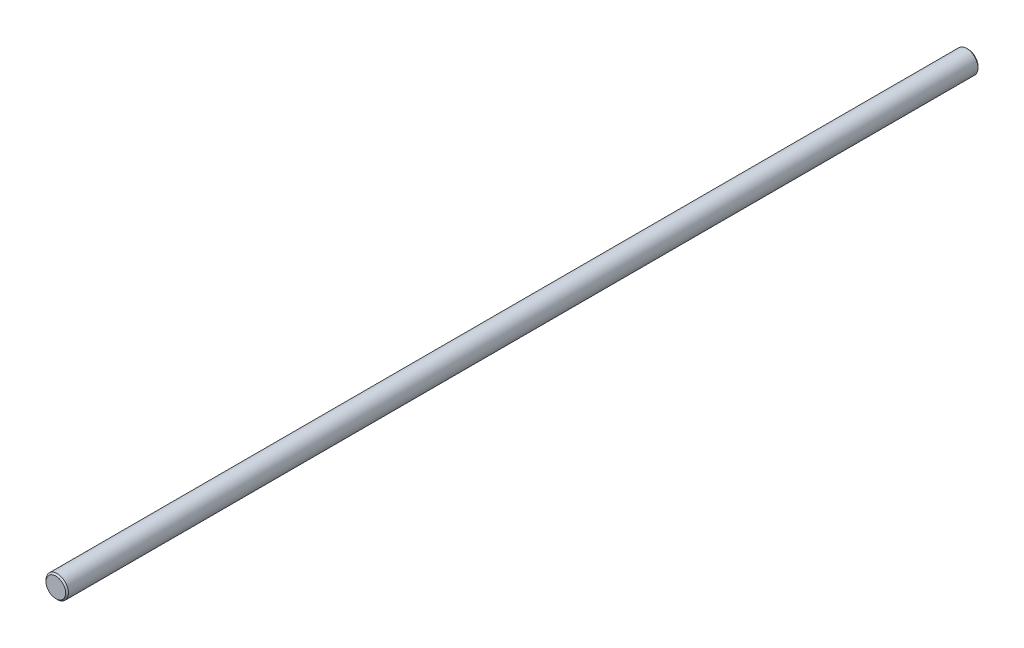
ISO-10303-21;
HEADER;
FILE_DESCRIPTION(('STEP AP214'),'2;1');
FILE_NAME('part.step','',(''),(''),'','','');
FILE_SCHEMA(('AUTOMOTIVE_DESIGN { 1 0 10303 214 1 1 1 1 }'));
ENDSEC;
DATA;
#1=APPLICATION_CONTEXT('core data for automotive mechanical design processes');
#2=APPLICATION_PROTOCOL_DEFINITION('international standard','automotive_design',2000,#1);
#3=PRODUCT_CONTEXT('',#1,'mechanical');
#4=PRODUCT('Part','Part','',(#3));
#5=PRODUCT_RELATED_PRODUCT_CATEGORY('part','',(#4));
#6=PRODUCT_DEFINITION_FORMATION('','',#4);
#7=PRODUCT_DEFINITION_CONTEXT('part definition',#1,'design');
#8=PRODUCT_DEFINITION('design','',#6,#7);
#9=PRODUCT_DEFINITION_SHAPE('','',#8);
#10=(LENGTH_UNIT() NAMED_UNIT(*) SI_UNIT(.MILLI.,.METRE.));
#11=(NAMED_UNIT(*) PLANE_ANGLE_UNIT() SI_UNIT($,.RADIAN.));
#12=(NAMED_UNIT(*) SI_UNIT($,.STERADIAN.) SOLID_ANGLE_UNIT());
#13=UNCERTAINTY_MEASURE_WITH_UNIT(LENGTH_MEASURE(1.E-05),#10,'distance_accuracy_value','');
#14=(GEOMETRIC_REPRESENTATION_CONTEXT(3) GLOBAL_UNCERTAINTY_ASSIGNED_CONTEXT((#13)) GLOBAL_UNIT_ASSIGNED_CONTEXT((#10,
#11,#12)) REPRESENTATION_CONTEXT('',''));
#15=CARTESIAN_POINT('',(0.,0.,0.));
#16=DIRECTION('',(0.,0.,1.));
#17=DIRECTION('',(1.,0.,0.));
#18=AXIS2_PLACEMENT_3D('',#15,#16,#17);
#19=CARTESIAN_POINT('',(0.,0.,650.));
#20=DIRECTION('',(0.,0.,-1.));
#21=DIRECTION('',(-1.,0.,0.));
#22=AXIS2_PLACEMENT_3D('',#19,#20,#21);
#23=CYLINDRICAL_SURFACE('',#22,8.);
#24=CARTESIAN_POINT('',(0.,0.,649.));
#25=DIRECTION('',(0.,0.,1.));
#26=DIRECTION('',(1.,0.,0.));
#27=AXIS2_PLACEMENT_3D('',#24,#25,#26);
#28=CIRCLE('',#27,8.);
#29=CARTESIAN_POINT('',(8.,0.,649.));
#30=VERTEX_POINT('',#29);
#31=EDGE_CURVE('E39',#30,#30,#28,.F.);
#32=ORIENTED_EDGE('',*,*,#31,.T.);
#33=EDGE_LOOP('',(#32));
#34=FACE_BOUND('',#33,.T.);
#35=CARTESIAN_POINT('',(0.,0.,1.));
#36=DIRECTION('',(0.,0.,1.));
#37=DIRECTION('',(1.,0.,0.));
#38=AXIS2_PLACEMENT_3D('',#35,#36,#37);
#39=CIRCLE('',#38,8.);
#40=CARTESIAN_POINT('',(8.,0.,1.));
#41=VERTEX_POINT('',#40);
#42=EDGE_CURVE('E43',#41,#41,#39,.T.);
#43=ORIENTED_EDGE('',*,*,#42,.T.);
#44=EDGE_LOOP('',(#43));
#45=FACE_BOUND('',#44,.T.);
#46=ADVANCED_FACE('F32',(#34,#45),#23,.T.);
#47=CARTESIAN_POINT('',(0.,0.,650.));
#48=DIRECTION('',(0.,0.,1.));
#49=DIRECTION('',(1.,0.,0.));
#50=AXIS2_PLACEMENT_3D('',#47,#48,#49);
#51=PLANE('',#50);
#52=CARTESIAN_POINT('',(0.,0.,650.));
#53=DIRECTION('',(0.,0.,1.));
#54=DIRECTION('',(1.,0.,0.));
#55=AXIS2_PLACEMENT_3D('',#52,#53,#54);
#56=CIRCLE('',#55,7.00000000000001);
#57=CARTESIAN_POINT('',(7.00000000000001,0.,650.));
#58=VERTEX_POINT('',#57);
#59=EDGE_CURVE('E47',#58,#58,#56,.T.);
#60=ORIENTED_EDGE('',*,*,#59,.T.);
#61=EDGE_LOOP('',(#60));
#62=FACE_BOUND('',#61,.T.);
#63=ADVANCED_FACE('F53',(#62),#51,.T.);
#64=CARTESIAN_POINT('',(0.,0.,0.));
#65=DIRECTION('',(0.,0.,1.));
#66=DIRECTION('',(1.,0.,0.));
#67=AXIS2_PLACEMENT_3D('',#64,#65,#66);
#68=PLANE('',#67);
#69=CARTESIAN_POINT('',(0.,0.,0.));
#70=DIRECTION('',(0.,0.,1.));
#71=DIRECTION('',(1.,0.,0.));
#72=AXIS2_PLACEMENT_3D('',#69,#70,#71);
#73=CIRCLE('',#72,6.99999999999995);
#74=CARTESIAN_POINT('',(6.99999999999995,0.,0.));
#75=VERTEX_POINT('',#74);
#76=EDGE_CURVE('E10',#75,#75,#73,.F.);
#77=ORIENTED_EDGE('',*,*,#76,.T.);
#78=EDGE_LOOP('',(#77));
#79=FACE_BOUND('',#78,.T.);
#80=ADVANCED_FACE('F57',(#79),#68,.F.);
#81=CARTESIAN_POINT('',(0.,0.,650.));
#82=DIRECTION('',(0.,0.,-1.));
#83=DIRECTION('',(-1.,0.,0.));
#84=AXIS2_PLACEMENT_3D('',#81,#82,#83);
#85=CONICAL_SURFACE('',#84,7.00000000000001,0.7853981633975);
#86=ORIENTED_EDGE('',*,*,#31,.F.);
#87=EDGE_LOOP('',(#86));
#88=FACE_BOUND('',#87,.T.);
#89=ORIENTED_EDGE('',*,*,#59,.F.);
#90=EDGE_LOOP('',(#89));
#91=FACE_BOUND('',#90,.T.);
#92=ADVANCED_FACE('F55',(#88,#91),#85,.T.);
#93=CARTESIAN_POINT('',(0.,0.,1.));
#94=DIRECTION('',(0.,0.,1.));
#95=DIRECTION('',(1.,0.,0.));
#96=AXIS2_PLACEMENT_3D('',#93,#94,#95);
#97=CONICAL_SURFACE('',#96,8.,0.785398163397473);
#98=ORIENTED_EDGE('',*,*,#76,.F.);
#99=EDGE_LOOP('',(#98));
#100=FACE_BOUND('',#99,.T.);
#101=ORIENTED_EDGE('',*,*,#42,.F.);
#102=EDGE_LOOP('',(#101));
#103=FACE_BOUND('',#102,.T.);
#104=ADVANCED_FACE('F34',(#100,#103),#97,.T.);
#105=CLOSED_SHELL('',(#46,#63,#80,#92,#104));
#106=MANIFOLD_SOLID_BREP('B2',#105);
#107=ADVANCED_BREP_SHAPE_REPRESENTATION('',(#18,#106),#14);
#108=SHAPE_DEFINITION_REPRESENTATION(#9,#107);
ENDSEC;
END-ISO-10303-21;
